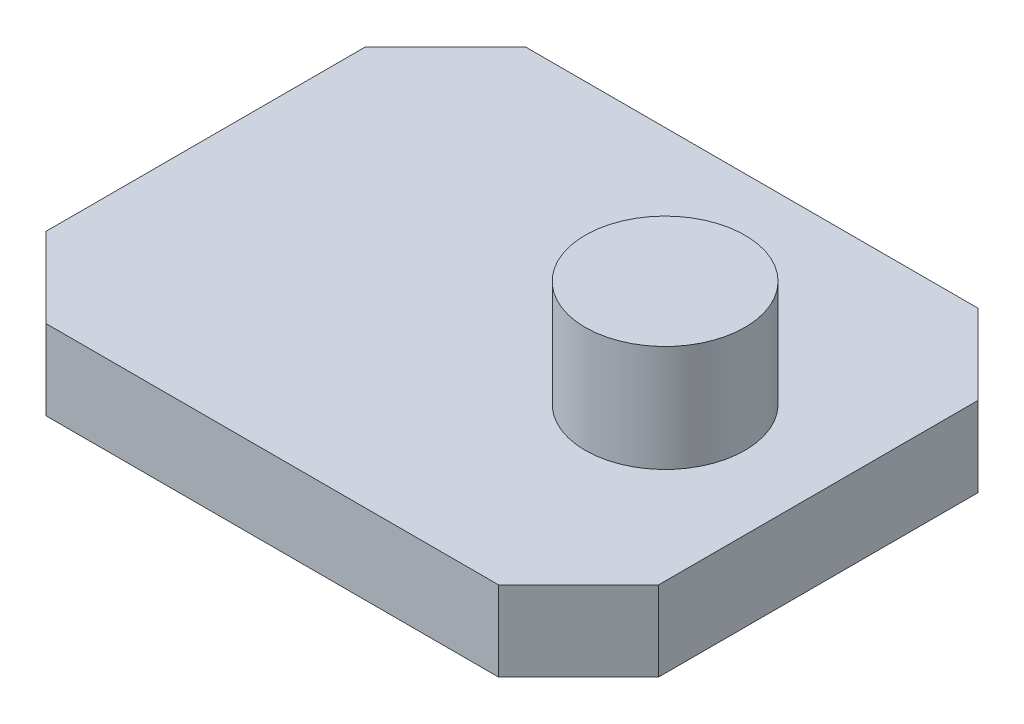
ISO-10303-21;
HEADER;
FILE_DESCRIPTION(('STEP AP214'),'2;1');
FILE_NAME('part.step','',(''),(''),'','','');
FILE_SCHEMA(('AUTOMOTIVE_DESIGN { 1 0 10303 214 1 1 1 1 }'));
ENDSEC;
DATA;
#1=APPLICATION_CONTEXT('core data for automotive mechanical design processes');
#2=APPLICATION_PROTOCOL_DEFINITION('international standard','automotive_design',2000,#1);
#3=PRODUCT_CONTEXT('',#1,'mechanical');
#4=PRODUCT('Part','Part','',(#3));
#5=PRODUCT_RELATED_PRODUCT_CATEGORY('part','',(#4));
#6=PRODUCT_DEFINITION_FORMATION('','',#4);
#7=PRODUCT_DEFINITION_CONTEXT('part definition',#1,'design');
#8=PRODUCT_DEFINITION('design','',#6,#7);
#9=PRODUCT_DEFINITION_SHAPE('','',#8);
#10=(LENGTH_UNIT() NAMED_UNIT(*) SI_UNIT(.MILLI.,.METRE.));
#11=(NAMED_UNIT(*) PLANE_ANGLE_UNIT() SI_UNIT($,.RADIAN.));
#12=(NAMED_UNIT(*) SI_UNIT($,.STERADIAN.) SOLID_ANGLE_UNIT());
#13=UNCERTAINTY_MEASURE_WITH_UNIT(LENGTH_MEASURE(1.E-05),#10,'distance_accuracy_value','');
#14=(GEOMETRIC_REPRESENTATION_CONTEXT(3) GLOBAL_UNCERTAINTY_ASSIGNED_CONTEXT((#13)) GLOBAL_UNIT_ASSIGNED_CONTEXT((#10,
#11,#12)) REPRESENTATION_CONTEXT('',''));
#15=CARTESIAN_POINT('',(0.,0.,0.));
#16=DIRECTION('',(0.,0.,1.));
#17=DIRECTION('',(1.,0.,0.));
#18=AXIS2_PLACEMENT_3D('',#15,#16,#17);
#19=CARTESIAN_POINT('',(11.5,3.,9.));
#20=DIRECTION('',(-1.,0.,0.));
#21=DIRECTION('',(0.,0.,1.));
#22=AXIS2_PLACEMENT_3D('',#19,#20,#21);
#23=PLANE('',#22);
#24=DIRECTION('',(0.,0.,-1.));
#25=VECTOR('',#24,1.);
#26=CARTESIAN_POINT('',(11.5,0.,9.));
#27=LINE('',#26,#25);
#28=CARTESIAN_POINT('',(11.5,0.,6.));
#29=VERTEX_POINT('',#28);
#30=CARTESIAN_POINT('',(11.5,0.,-5.99999999999999));
#31=VERTEX_POINT('',#30);
#32=EDGE_CURVE('E133',#29,#31,#27,.T.);
#33=ORIENTED_EDGE('',*,*,#32,.T.);
#34=DIRECTION('',(0.,1.,0.));
#35=VECTOR('',#34,1.);
#36=CARTESIAN_POINT('',(11.5,3.,-5.99999999999999));
#37=LINE('',#36,#35);
#38=CARTESIAN_POINT('',(11.5,3.,-5.99999999999999));
#39=VERTEX_POINT('',#38);
#40=EDGE_CURVE('E115',#31,#39,#37,.T.);
#41=ORIENTED_EDGE('',*,*,#40,.T.);
#42=DIRECTION('',(0.,0.,-1.));
#43=VECTOR('',#42,1.);
#44=CARTESIAN_POINT('',(11.5,3.,9.));
#45=LINE('',#44,#43);
#46=CARTESIAN_POINT('',(11.5,3.,6.));
#47=VERTEX_POINT('',#46);
#48=EDGE_CURVE('E145',#47,#39,#45,.T.);
#49=ORIENTED_EDGE('',*,*,#48,.F.);
#50=DIRECTION('',(0.,-1.,0.));
#51=VECTOR('',#50,1.);
#52=CARTESIAN_POINT('',(11.5,3.,6.));
#53=LINE('',#52,#51);
#54=EDGE_CURVE('E116',#47,#29,#53,.T.);
#55=ORIENTED_EDGE('',*,*,#54,.T.);
#56=EDGE_LOOP('',(#33,#41,#49,#55));
#57=FACE_BOUND('',#56,.T.);
#58=ADVANCED_FACE('F37',(#57),#23,.F.);
#59=CARTESIAN_POINT('',(-11.5,3.,-9.));
#60=DIRECTION('',(0.,0.,1.));
#61=DIRECTION('',(1.,0.,0.));
#62=AXIS2_PLACEMENT_3D('',#59,#60,#61);
#63=PLANE('',#62);
#64=DIRECTION('',(-1.,0.,0.));
#65=VECTOR('',#64,1.);
#66=CARTESIAN_POINT('',(-11.5,3.,-9.));
#67=LINE('',#66,#65);
#68=CARTESIAN_POINT('',(8.5,3.,-9.));
#69=VERTEX_POINT('',#68);
#70=CARTESIAN_POINT('',(-8.49999999999999,3.,-9.));
#71=VERTEX_POINT('',#70);
#72=EDGE_CURVE('E130',#69,#71,#67,.T.);
#73=ORIENTED_EDGE('',*,*,#72,.F.);
#74=DIRECTION('',(0.,-1.,0.));
#75=VECTOR('',#74,1.);
#76=CARTESIAN_POINT('',(8.5,3.,-9.));
#77=LINE('',#76,#75);
#78=CARTESIAN_POINT('',(8.5,0.,-9.));
#79=VERTEX_POINT('',#78);
#80=EDGE_CURVE('E112',#69,#79,#77,.T.);
#81=ORIENTED_EDGE('',*,*,#80,.T.);
#82=DIRECTION('',(-1.,0.,0.));
#83=VECTOR('',#82,1.);
#84=CARTESIAN_POINT('',(-11.5,0.,-9.));
#85=LINE('',#84,#83);
#86=CARTESIAN_POINT('',(-8.49999999999999,0.,-9.));
#87=VERTEX_POINT('',#86);
#88=EDGE_CURVE('E123',#79,#87,#85,.T.);
#89=ORIENTED_EDGE('',*,*,#88,.T.);
#90=DIRECTION('',(0.,1.,0.));
#91=VECTOR('',#90,1.);
#92=CARTESIAN_POINT('',(-8.49999999999999,3.,-9.));
#93=LINE('',#92,#91);
#94=EDGE_CURVE('E129',#87,#71,#93,.T.);
#95=ORIENTED_EDGE('',*,*,#94,.T.);
#96=EDGE_LOOP('',(#73,#81,#89,#95));
#97=FACE_BOUND('',#96,.T.);
#98=ADVANCED_FACE('F122',(#97),#63,.F.);
#99=CARTESIAN_POINT('',(-11.5,3.,9.));
#100=DIRECTION('',(1.,0.,0.));
#101=DIRECTION('',(0.,0.,-1.));
#102=AXIS2_PLACEMENT_3D('',#99,#100,#101);
#103=PLANE('',#102);
#104=DIRECTION('',(0.,0.,1.));
#105=VECTOR('',#104,1.);
#106=CARTESIAN_POINT('',(-11.5,0.,9.));
#107=LINE('',#106,#105);
#108=CARTESIAN_POINT('',(-11.5,0.,-6.));
#109=VERTEX_POINT('',#108);
#110=CARTESIAN_POINT('',(-11.5,0.,5.99999999999999));
#111=VERTEX_POINT('',#110);
#112=EDGE_CURVE('E135',#109,#111,#107,.T.);
#113=ORIENTED_EDGE('',*,*,#112,.T.);
#114=DIRECTION('',(0.,1.,0.));
#115=VECTOR('',#114,1.);
#116=CARTESIAN_POINT('',(-11.5,3.,5.99999999999999));
#117=LINE('',#116,#115);
#118=CARTESIAN_POINT('',(-11.5,3.,5.99999999999999));
#119=VERTEX_POINT('',#118);
#120=EDGE_CURVE('E11',#111,#119,#117,.T.);
#121=ORIENTED_EDGE('',*,*,#120,.T.);
#122=DIRECTION('',(0.,0.,1.));
#123=VECTOR('',#122,1.);
#124=CARTESIAN_POINT('',(-11.5,3.,9.));
#125=LINE('',#124,#123);
#126=CARTESIAN_POINT('',(-11.5,3.,-6.));
#127=VERTEX_POINT('',#126);
#128=EDGE_CURVE('E168',#127,#119,#125,.T.);
#129=ORIENTED_EDGE('',*,*,#128,.F.);
#130=DIRECTION('',(0.,-1.,0.));
#131=VECTOR('',#130,1.);
#132=CARTESIAN_POINT('',(-11.5,3.,-6.));
#133=LINE('',#132,#131);
#134=EDGE_CURVE('E47',#127,#109,#133,.T.);
#135=ORIENTED_EDGE('',*,*,#134,.T.);
#136=EDGE_LOOP('',(#113,#121,#129,#135));
#137=FACE_BOUND('',#136,.T.);
#138=ADVANCED_FACE('F169',(#137),#103,.F.);
#139=CARTESIAN_POINT('',(-11.5,3.,9.));
#140=DIRECTION('',(0.,0.,-1.));
#141=DIRECTION('',(-1.,0.,0.));
#142=AXIS2_PLACEMENT_3D('',#139,#140,#141);
#143=PLANE('',#142);
#144=DIRECTION('',(1.,0.,0.));
#145=VECTOR('',#144,1.);
#146=CARTESIAN_POINT('',(-11.5,0.,9.));
#147=LINE('',#146,#145);
#148=CARTESIAN_POINT('',(-8.5,0.,9.));
#149=VERTEX_POINT('',#148);
#150=CARTESIAN_POINT('',(8.49999999999999,0.,9.));
#151=VERTEX_POINT('',#150);
#152=EDGE_CURVE('E136',#149,#151,#147,.T.);
#153=ORIENTED_EDGE('',*,*,#152,.T.);
#154=DIRECTION('',(0.,1.,0.));
#155=VECTOR('',#154,1.);
#156=CARTESIAN_POINT('',(8.49999999999999,3.,9.));
#157=LINE('',#156,#155);
#158=CARTESIAN_POINT('',(8.49999999999999,3.,9.));
#159=VERTEX_POINT('',#158);
#160=EDGE_CURVE('E57',#151,#159,#157,.T.);
#161=ORIENTED_EDGE('',*,*,#160,.T.);
#162=DIRECTION('',(1.,0.,0.));
#163=VECTOR('',#162,1.);
#164=CARTESIAN_POINT('',(-11.5,3.,9.));
#165=LINE('',#164,#163);
#166=CARTESIAN_POINT('',(-8.5,3.,9.));
#167=VERTEX_POINT('',#166);
#168=EDGE_CURVE('E177',#167,#159,#165,.T.);
#169=ORIENTED_EDGE('',*,*,#168,.F.);
#170=DIRECTION('',(0.,-1.,0.));
#171=VECTOR('',#170,1.);
#172=CARTESIAN_POINT('',(-8.5,3.,9.));
#173=LINE('',#172,#171);
#174=EDGE_CURVE('E161',#167,#149,#173,.T.);
#175=ORIENTED_EDGE('',*,*,#174,.T.);
#176=EDGE_LOOP('',(#153,#161,#169,#175));
#177=FACE_BOUND('',#176,.T.);
#178=ADVANCED_FACE('F180',(#177),#143,.F.);
#179=CARTESIAN_POINT('',(0.,3.,0.));
#180=DIRECTION('',(0.,-1.,0.));
#181=DIRECTION('',(0.,0.,-1.));
#182=AXIS2_PLACEMENT_3D('',#179,#180,#181);
#183=PLANE('',#182);
#184=CARTESIAN_POINT('',(5.75,3.,0.));
#185=DIRECTION('',(0.,1.,0.));
#186=DIRECTION('',(0.,0.,1.));
#187=AXIS2_PLACEMENT_3D('',#184,#185,#186);
#188=CIRCLE('',#187,3.);
#189=CARTESIAN_POINT('',(5.75,3.,3.));
#190=VERTEX_POINT('',#189);
#191=EDGE_CURVE('E144',#190,#190,#188,.T.);
#192=ORIENTED_EDGE('',*,*,#191,.F.);
#193=EDGE_LOOP('',(#192));
#194=FACE_BOUND('',#193,.T.);
#195=ORIENTED_EDGE('',*,*,#48,.T.);
#196=DIRECTION('',(0.707106781186546,0.,0.707106781186549));
#197=VECTOR('',#196,1.);
#198=CARTESIAN_POINT('',(8.5,3.,-9.));
#199=LINE('',#198,#197);
#200=EDGE_CURVE('E157',#39,#69,#199,.F.);
#201=ORIENTED_EDGE('',*,*,#200,.T.);
#202=ORIENTED_EDGE('',*,*,#72,.T.);
#203=DIRECTION('',(0.707106781186549,0.,-0.707106781186546));
#204=VECTOR('',#203,1.);
#205=CARTESIAN_POINT('',(-11.5,3.,-6.));
#206=LINE('',#205,#204);
#207=EDGE_CURVE('E152',#71,#127,#206,.F.);
#208=ORIENTED_EDGE('',*,*,#207,.T.);
#209=ORIENTED_EDGE('',*,*,#128,.T.);
#210=DIRECTION('',(-0.707106781186546,0.,-0.707106781186549));
#211=VECTOR('',#210,1.);
#212=CARTESIAN_POINT('',(-8.5,3.,9.));
#213=LINE('',#212,#211);
#214=EDGE_CURVE('E65',#119,#167,#213,.F.);
#215=ORIENTED_EDGE('',*,*,#214,.T.);
#216=ORIENTED_EDGE('',*,*,#168,.T.);
#217=DIRECTION('',(-0.707106781186549,0.,0.707106781186546));
#218=VECTOR('',#217,1.);
#219=CARTESIAN_POINT('',(11.5,3.,6.));
#220=LINE('',#219,#218);
#221=EDGE_CURVE('E160',#159,#47,#220,.F.);
#222=ORIENTED_EDGE('',*,*,#221,.T.);
#223=EDGE_LOOP('',(#195,#201,#202,#208,#209,#215,#216,#222));
#224=FACE_BOUND('',#223,.T.);
#225=ADVANCED_FACE('F196',(#194,#224),#183,.F.);
#226=CARTESIAN_POINT('',(0.,0.,0.));
#227=DIRECTION('',(0.,-1.,0.));
#228=DIRECTION('',(0.,0.,-1.));
#229=AXIS2_PLACEMENT_3D('',#226,#227,#228);
#230=PLANE('',#229);
#231=ORIENTED_EDGE('',*,*,#88,.F.);
#232=DIRECTION('',(-0.707106781186546,0.,-0.707106781186549));
#233=VECTOR('',#232,1.);
#234=CARTESIAN_POINT('',(8.75000000000001,0.,-8.74999999999999));
#235=LINE('',#234,#233);
#236=EDGE_CURVE('E110',#79,#31,#235,.F.);
#237=ORIENTED_EDGE('',*,*,#236,.T.);
#238=ORIENTED_EDGE('',*,*,#32,.F.);
#239=DIRECTION('',(0.707106781186549,0.,-0.707106781186546));
#240=VECTOR('',#239,1.);
#241=CARTESIAN_POINT('',(8.74999999999998,0.,8.75000000000001));
#242=LINE('',#241,#240);
#243=EDGE_CURVE('E120',#29,#151,#242,.F.);
#244=ORIENTED_EDGE('',*,*,#243,.T.);
#245=ORIENTED_EDGE('',*,*,#152,.F.);
#246=DIRECTION('',(0.707106781186546,0.,0.707106781186549));
#247=VECTOR('',#246,1.);
#248=CARTESIAN_POINT('',(-8.75000000000001,0.,8.74999999999999));
#249=LINE('',#248,#247);
#250=EDGE_CURVE('E146',#149,#111,#249,.F.);
#251=ORIENTED_EDGE('',*,*,#250,.T.);
#252=ORIENTED_EDGE('',*,*,#112,.F.);
#253=DIRECTION('',(-0.707106781186549,0.,0.707106781186546));
#254=VECTOR('',#253,1.);
#255=CARTESIAN_POINT('',(-8.74999999999998,0.,-8.75000000000001));
#256=LINE('',#255,#254);
#257=EDGE_CURVE('E126',#109,#87,#256,.F.);
#258=ORIENTED_EDGE('',*,*,#257,.T.);
#259=EDGE_LOOP('',(#231,#237,#238,#244,#245,#251,#252,#258));
#260=FACE_BOUND('',#259,.T.);
#261=ADVANCED_FACE('F134',(#260),#230,.T.);
#262=CARTESIAN_POINT('',(5.75,7.,0.));
#263=DIRECTION('',(0.,-1.,0.));
#264=DIRECTION('',(0.,0.,-1.));
#265=AXIS2_PLACEMENT_3D('',#262,#263,#264);
#266=CYLINDRICAL_SURFACE('',#265,3.);
#267=CARTESIAN_POINT('',(5.75,7.,0.));
#268=DIRECTION('',(0.,1.,0.));
#269=DIRECTION('',(0.,0.,1.));
#270=AXIS2_PLACEMENT_3D('',#267,#268,#269);
#271=CIRCLE('',#270,3.);
#272=CARTESIAN_POINT('',(5.75,7.,3.));
#273=VERTEX_POINT('',#272);
#274=EDGE_CURVE('E138',#273,#273,#271,.T.);
#275=ORIENTED_EDGE('',*,*,#274,.F.);
#276=EDGE_LOOP('',(#275));
#277=FACE_BOUND('',#276,.T.);
#278=ORIENTED_EDGE('',*,*,#191,.T.);
#279=EDGE_LOOP('',(#278));
#280=FACE_BOUND('',#279,.T.);
#281=ADVANCED_FACE('F191',(#277,#280),#266,.T.);
#282=CARTESIAN_POINT('',(5.75,7.,0.));
#283=DIRECTION('',(0.,1.,0.));
#284=DIRECTION('',(0.,0.,1.));
#285=AXIS2_PLACEMENT_3D('',#282,#283,#284);
#286=PLANE('',#285);
#287=ORIENTED_EDGE('',*,*,#274,.T.);
#288=EDGE_LOOP('',(#287));
#289=FACE_BOUND('',#288,.T.);
#290=ADVANCED_FACE('F187',(#289),#286,.T.);
#291=CARTESIAN_POINT('',(8.5,3.,-9.));
#292=DIRECTION('',(-0.707106781186549,0.,0.707106781186546));
#293=DIRECTION('',(0.,-1.,0.));
#294=AXIS2_PLACEMENT_3D('',#291,#292,#293);
#295=PLANE('',#294);
#296=ORIENTED_EDGE('',*,*,#200,.F.);
#297=ORIENTED_EDGE('',*,*,#40,.F.);
#298=ORIENTED_EDGE('',*,*,#236,.F.);
#299=ORIENTED_EDGE('',*,*,#80,.F.);
#300=EDGE_LOOP('',(#296,#297,#298,#299));
#301=FACE_BOUND('',#300,.T.);
#302=ADVANCED_FACE('F109',(#301),#295,.F.);
#303=CARTESIAN_POINT('',(11.5,3.,6.));
#304=DIRECTION('',(-0.707106781186546,0.,-0.707106781186549));
#305=DIRECTION('',(0.,-1.,0.));
#306=AXIS2_PLACEMENT_3D('',#303,#304,#305);
#307=PLANE('',#306);
#308=ORIENTED_EDGE('',*,*,#221,.F.);
#309=ORIENTED_EDGE('',*,*,#160,.F.);
#310=ORIENTED_EDGE('',*,*,#243,.F.);
#311=ORIENTED_EDGE('',*,*,#54,.F.);
#312=EDGE_LOOP('',(#308,#309,#310,#311));
#313=FACE_BOUND('',#312,.T.);
#314=ADVANCED_FACE('F202',(#313),#307,.F.);
#315=CARTESIAN_POINT('',(-8.5,3.,9.));
#316=DIRECTION('',(0.707106781186549,0.,-0.707106781186546));
#317=DIRECTION('',(0.,-1.,0.));
#318=AXIS2_PLACEMENT_3D('',#315,#316,#317);
#319=PLANE('',#318);
#320=ORIENTED_EDGE('',*,*,#214,.F.);
#321=ORIENTED_EDGE('',*,*,#120,.F.);
#322=ORIENTED_EDGE('',*,*,#250,.F.);
#323=ORIENTED_EDGE('',*,*,#174,.F.);
#324=EDGE_LOOP('',(#320,#321,#322,#323));
#325=FACE_BOUND('',#324,.T.);
#326=ADVANCED_FACE('F176',(#325),#319,.F.);
#327=CARTESIAN_POINT('',(-11.5,3.,-6.));
#328=DIRECTION('',(0.707106781186546,0.,0.707106781186549));
#329=DIRECTION('',(0.,-1.,0.));
#330=AXIS2_PLACEMENT_3D('',#327,#328,#329);
#331=PLANE('',#330);
#332=ORIENTED_EDGE('',*,*,#207,.F.);
#333=ORIENTED_EDGE('',*,*,#94,.F.);
#334=ORIENTED_EDGE('',*,*,#257,.F.);
#335=ORIENTED_EDGE('',*,*,#134,.F.);
#336=EDGE_LOOP('',(#332,#333,#334,#335));
#337=FACE_BOUND('',#336,.T.);
#338=ADVANCED_FACE('F43',(#337),#331,.F.);
#339=CLOSED_SHELL('',(#58,#98,#138,#178,#225,#261,#281,#290,#302,#314,#326,#338));
#340=MANIFOLD_SOLID_BREP('B2',#339);
#341=ADVANCED_BREP_SHAPE_REPRESENTATION('',(#18,#340),#14);
#342=SHAPE_DEFINITION_REPRESENTATION(#9,#341);
ENDSEC;
END-ISO-10303-21;
